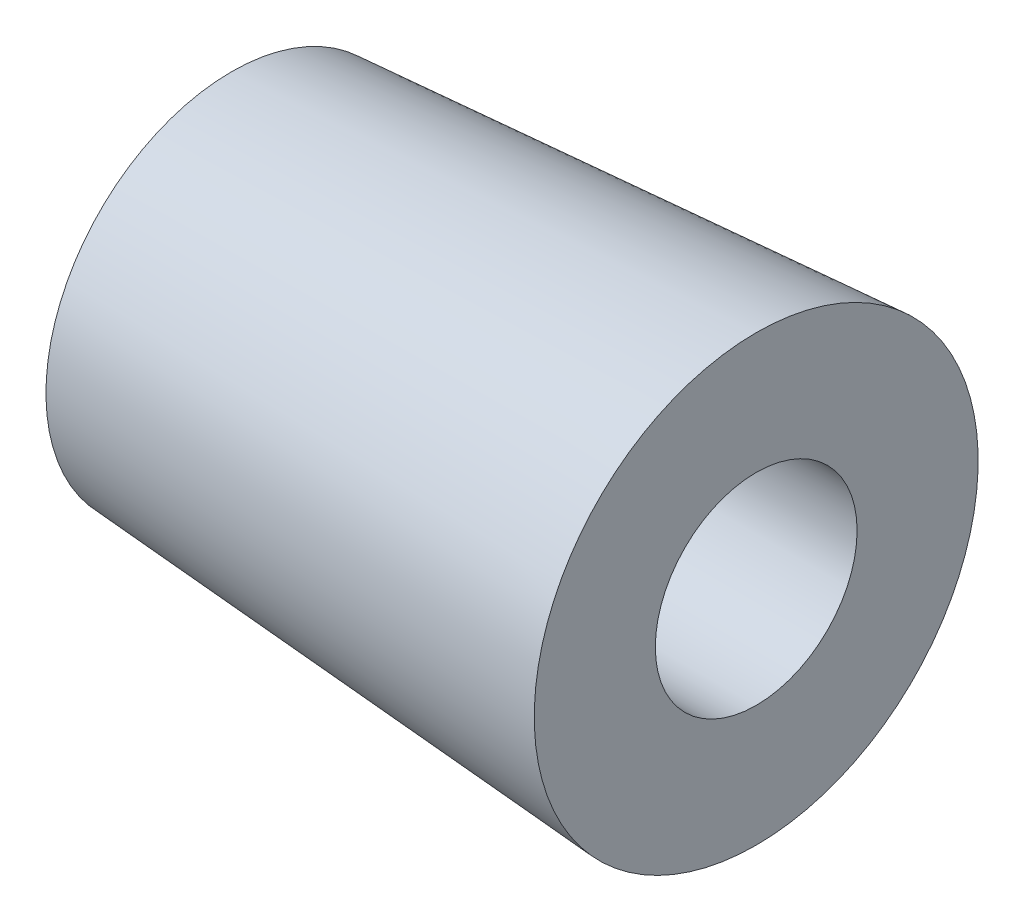
ISO-10303-21;
HEADER;
FILE_DESCRIPTION(('STEP AP214'),'2;1');
FILE_NAME('part.step','',(''),(''),'','','');
FILE_SCHEMA(('AUTOMOTIVE_DESIGN { 1 0 10303 214 1 1 1 1 }'));
ENDSEC;
DATA;
#1=APPLICATION_CONTEXT('core data for automotive mechanical design processes');
#2=APPLICATION_PROTOCOL_DEFINITION('international standard','automotive_design',2000,#1);
#3=PRODUCT_CONTEXT('',#1,'mechanical');
#4=PRODUCT('Part','Part','',(#3));
#5=PRODUCT_RELATED_PRODUCT_CATEGORY('part','',(#4));
#6=PRODUCT_DEFINITION_FORMATION('','',#4);
#7=PRODUCT_DEFINITION_CONTEXT('part definition',#1,'design');
#8=PRODUCT_DEFINITION('design','',#6,#7);
#9=PRODUCT_DEFINITION_SHAPE('','',#8);
#10=(LENGTH_UNIT() NAMED_UNIT(*) SI_UNIT(.MILLI.,.METRE.));
#11=(NAMED_UNIT(*) PLANE_ANGLE_UNIT() SI_UNIT($,.RADIAN.));
#12=(NAMED_UNIT(*) SI_UNIT($,.STERADIAN.) SOLID_ANGLE_UNIT());
#13=UNCERTAINTY_MEASURE_WITH_UNIT(LENGTH_MEASURE(1.E-05),#10,'distance_accuracy_value','');
#14=(GEOMETRIC_REPRESENTATION_CONTEXT(3) GLOBAL_UNCERTAINTY_ASSIGNED_CONTEXT((#13)) GLOBAL_UNIT_ASSIGNED_CONTEXT((#10,
#11,#12)) REPRESENTATION_CONTEXT('',''));
#15=CARTESIAN_POINT('',(0.,0.,0.));
#16=DIRECTION('',(0.,0.,1.));
#17=DIRECTION('',(1.,0.,0.));
#18=AXIS2_PLACEMENT_3D('',#15,#16,#17);
#19=CARTESIAN_POINT('',(0.,0.,0.));
#20=DIRECTION('',(-1.,0.,0.));
#21=DIRECTION('',(0.,0.,1.));
#22=AXIS2_PLACEMENT_3D('',#19,#20,#21);
#23=CYLINDRICAL_SURFACE('',#22,250.);
#24=CARTESIAN_POINT('',(4800.,0.,0.));
#25=DIRECTION('',(-1.,0.,0.));
#26=DIRECTION('',(0.,0.,1.));
#27=AXIS2_PLACEMENT_3D('',#24,#25,#26);
#28=CIRCLE('',#27,250.);
#29=CARTESIAN_POINT('',(4800.,250.,-1.79489651492081E-06));
#30=VERTEX_POINT('',#29);
#31=CARTESIAN_POINT('',(4800.,250.,0.));
#32=VERTEX_POINT('',#31);
#33=EDGE_CURVE('E11',#30,#32,#28,.T.);
#34=ORIENTED_EDGE('',*,*,#33,.T.);
#35=DIRECTION('',(1.,0.,0.));
#36=VECTOR('',#35,1.);
#37=CARTESIAN_POINT('',(6100.,250.,0.));
#38=LINE('',#37,#36);
#39=CARTESIAN_POINT('',(6100.,250.,0.));
#40=VERTEX_POINT('',#39);
#41=EDGE_CURVE('E100',#32,#40,#38,.T.);
#42=ORIENTED_EDGE('',*,*,#41,.T.);
#43=CARTESIAN_POINT('',(6100.,0.,0.));
#44=DIRECTION('',(-1.,0.,0.));
#45=DIRECTION('',(0.,0.,1.));
#46=AXIS2_PLACEMENT_3D('',#43,#44,#45);
#47=CIRCLE('',#46,250.);
#48=CARTESIAN_POINT('',(6100.,250.,-1.79489651492081E-06));
#49=VERTEX_POINT('',#48);
#50=EDGE_CURVE('E80',#49,#40,#47,.T.);
#51=ORIENTED_EDGE('',*,*,#50,.F.);
#52=DIRECTION('',(1.,0.,0.));
#53=VECTOR('',#52,1.);
#54=CARTESIAN_POINT('',(6100.,250.,-1.79489651492081E-06));
#55=LINE('',#54,#53);
#56=EDGE_CURVE('E103',#30,#49,#55,.T.);
#57=ORIENTED_EDGE('',*,*,#56,.F.);
#58=EDGE_LOOP('',(#34,#42,#51,#57));
#59=FACE_BOUND('',#58,.T.);
#60=ADVANCED_FACE('F39',(#59),#23,.F.);
#61=CARTESIAN_POINT('',(4800.,250.,-1.79489651492081E-06));
#62=DIRECTION('',(1.,0.,0.));
#63=DIRECTION('',(0.,0.,-1.));
#64=AXIS2_PLACEMENT_3D('',#61,#62,#63);
#65=PLANE('',#64);
#66=CARTESIAN_POINT('',(4800.,0.,0.));
#67=DIRECTION('',(-1.,0.,0.));
#68=DIRECTION('',(0.,0.,1.));
#69=AXIS2_PLACEMENT_3D('',#66,#67,#68);
#70=CIRCLE('',#69,460.);
#71=CARTESIAN_POINT('',(4800.,460.,-3.30260958745428E-06));
#72=VERTEX_POINT('',#71);
#73=CARTESIAN_POINT('',(4800.,460.,0.));
#74=VERTEX_POINT('',#73);
#75=EDGE_CURVE('E50',#72,#74,#70,.T.);
#76=ORIENTED_EDGE('',*,*,#75,.T.);
#77=DIRECTION('',(0.,-1.,0.));
#78=VECTOR('',#77,1.);
#79=CARTESIAN_POINT('',(4800.,250.,0.));
#80=LINE('',#79,#78);
#81=EDGE_CURVE('E104',#74,#32,#80,.T.);
#82=ORIENTED_EDGE('',*,*,#81,.T.);
#83=ORIENTED_EDGE('',*,*,#33,.F.);
#84=DIRECTION('',(0.,-1.,7.17958605968322E-09));
#85=VECTOR('',#84,1.);
#86=CARTESIAN_POINT('',(4800.,250.,-1.79489651492081E-06));
#87=LINE('',#86,#85);
#88=EDGE_CURVE('E91',#72,#30,#87,.T.);
#89=ORIENTED_EDGE('',*,*,#88,.F.);
#90=EDGE_LOOP('',(#76,#82,#83,#89));
#91=FACE_BOUND('',#90,.T.);
#92=ADVANCED_FACE('F41',(#91),#65,.F.);
#93=CARTESIAN_POINT('',(6100.,0.,0.));
#94=DIRECTION('',(1.,0.,0.));
#95=DIRECTION('',(0.,0.,-1.));
#96=AXIS2_PLACEMENT_3D('',#93,#94,#95);
#97=CONICAL_SURFACE('',#96,550.,0.0691204808471823);
#98=CARTESIAN_POINT('',(6100.,0.,0.));
#99=DIRECTION('',(-1.,0.,0.));
#100=DIRECTION('',(0.,0.,1.));
#101=AXIS2_PLACEMENT_3D('',#98,#99,#100);
#102=CIRCLE('',#101,550.);
#103=CARTESIAN_POINT('',(6100.,550.,-3.94877233282577E-06));
#104=VERTEX_POINT('',#103);
#105=CARTESIAN_POINT('',(6100.,550.,0.));
#106=VERTEX_POINT('',#105);
#107=EDGE_CURVE('E89',#104,#106,#102,.T.);
#108=ORIENTED_EDGE('',*,*,#107,.T.);
#109=DIRECTION('',(-0.997612130489456,-0.0690654551877316,0.));
#110=VECTOR('',#109,1.);
#111=CARTESIAN_POINT('',(4800.,460.,0.));
#112=LINE('',#111,#110);
#113=EDGE_CURVE('E97',#106,#74,#112,.T.);
#114=ORIENTED_EDGE('',*,*,#113,.T.);
#115=ORIENTED_EDGE('',*,*,#75,.F.);
#116=DIRECTION('',(-0.997612130489456,-0.0690654551877316,4.95861379271514E-10));
#117=VECTOR('',#116,1.);
#118=CARTESIAN_POINT('',(4800.,460.,-3.30260958745428E-06));
#119=LINE('',#118,#117);
#120=EDGE_CURVE('E109',#104,#72,#119,.T.);
#121=ORIENTED_EDGE('',*,*,#120,.F.);
#122=EDGE_LOOP('',(#108,#114,#115,#121));
#123=FACE_BOUND('',#122,.T.);
#124=ADVANCED_FACE('F112',(#123),#97,.T.);
#125=CARTESIAN_POINT('',(6100.,550.,-3.94877233282577E-06));
#126=DIRECTION('',(-1.,0.,0.));
#127=DIRECTION('',(0.,0.,1.));
#128=AXIS2_PLACEMENT_3D('',#125,#126,#127);
#129=PLANE('',#128);
#130=DIRECTION('',(0.,1.,-7.17958605968322E-09));
#131=VECTOR('',#130,1.);
#132=CARTESIAN_POINT('',(6100.,550.,-3.94877233282577E-06));
#133=LINE('',#132,#131);
#134=EDGE_CURVE('E82',#49,#104,#133,.T.);
#135=ORIENTED_EDGE('',*,*,#134,.F.);
#136=ORIENTED_EDGE('',*,*,#50,.T.);
#137=DIRECTION('',(0.,1.,0.));
#138=VECTOR('',#137,1.);
#139=CARTESIAN_POINT('',(6100.,550.,0.));
#140=LINE('',#139,#138);
#141=EDGE_CURVE('E85',#40,#106,#140,.T.);
#142=ORIENTED_EDGE('',*,*,#141,.T.);
#143=ORIENTED_EDGE('',*,*,#107,.F.);
#144=EDGE_LOOP('',(#135,#136,#142,#143));
#145=FACE_BOUND('',#144,.T.);
#146=ADVANCED_FACE('F83',(#145),#129,.F.);
#147=CARTESIAN_POINT('',(0.,0.,0.));
#148=DIRECTION('',(0.,-7.17958605968322E-09,-1.));
#149=DIRECTION('',(-1.,0.,0.));
#150=AXIS2_PLACEMENT_3D('',#147,#148,#149);
#151=PLANE('',#150);
#152=ORIENTED_EDGE('',*,*,#56,.T.);
#153=ORIENTED_EDGE('',*,*,#134,.T.);
#154=ORIENTED_EDGE('',*,*,#120,.T.);
#155=ORIENTED_EDGE('',*,*,#88,.T.);
#156=EDGE_LOOP('',(#152,#153,#154,#155));
#157=FACE_BOUND('',#156,.T.);
#158=ADVANCED_FACE('F111',(#157),#151,.F.);
#159=CARTESIAN_POINT('',(0.,0.,0.));
#160=DIRECTION('',(0.,0.,-1.));
#161=DIRECTION('',(-1.,0.,0.));
#162=AXIS2_PLACEMENT_3D('',#159,#160,#161);
#163=PLANE('',#162);
#164=ORIENTED_EDGE('',*,*,#41,.F.);
#165=ORIENTED_EDGE('',*,*,#81,.F.);
#166=ORIENTED_EDGE('',*,*,#113,.F.);
#167=ORIENTED_EDGE('',*,*,#141,.F.);
#168=EDGE_LOOP('',(#164,#165,#166,#167));
#169=FACE_BOUND('',#168,.T.);
#170=ADVANCED_FACE('F94',(#169),#163,.T.);
#171=CLOSED_SHELL('',(#60,#92,#124,#146,#158,#170));
#172=MANIFOLD_SOLID_BREP('B2',#171);
#173=ADVANCED_BREP_SHAPE_REPRESENTATION('',(#18,#172),#14);
#174=SHAPE_DEFINITION_REPRESENTATION(#9,#173);
ENDSEC;
END-ISO-10303-21;
